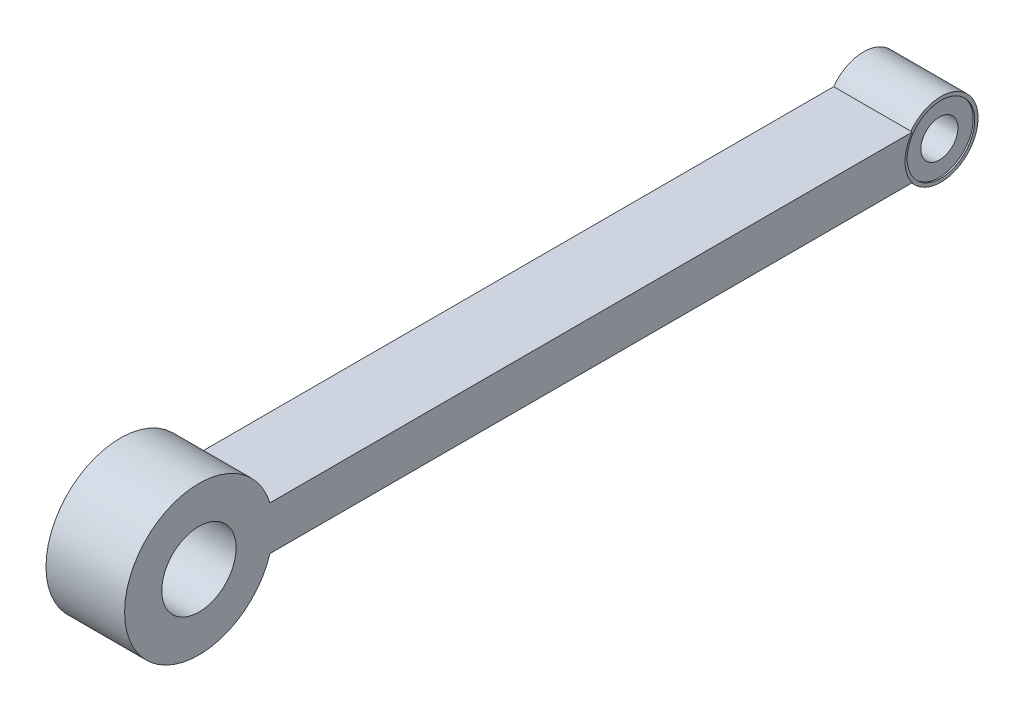
ISO-10303-21;
HEADER;
FILE_DESCRIPTION(('STEP AP214'),'2;1');
FILE_NAME('part.step','',(''),(''),'','','');
FILE_SCHEMA(('AUTOMOTIVE_DESIGN { 1 0 10303 214 1 1 1 1 }'));
ENDSEC;
DATA;
#1=APPLICATION_CONTEXT('core data for automotive mechanical design processes');
#2=APPLICATION_PROTOCOL_DEFINITION('international standard','automotive_design',2000,#1);
#3=PRODUCT_CONTEXT('',#1,'mechanical');
#4=PRODUCT('Part','Part','',(#3));
#5=PRODUCT_RELATED_PRODUCT_CATEGORY('part','',(#4));
#6=PRODUCT_DEFINITION_FORMATION('','',#4);
#7=PRODUCT_DEFINITION_CONTEXT('part definition',#1,'design');
#8=PRODUCT_DEFINITION('design','',#6,#7);
#9=PRODUCT_DEFINITION_SHAPE('','',#8);
#10=(LENGTH_UNIT() NAMED_UNIT(*) SI_UNIT(.MILLI.,.METRE.));
#11=(NAMED_UNIT(*) PLANE_ANGLE_UNIT() SI_UNIT($,.RADIAN.));
#12=(NAMED_UNIT(*) SI_UNIT($,.STERADIAN.) SOLID_ANGLE_UNIT());
#13=UNCERTAINTY_MEASURE_WITH_UNIT(LENGTH_MEASURE(1.E-05),#10,'distance_accuracy_value','');
#14=(GEOMETRIC_REPRESENTATION_CONTEXT(3) GLOBAL_UNCERTAINTY_ASSIGNED_CONTEXT((#13)) GLOBAL_UNIT_ASSIGNED_CONTEXT((#10,
#11,#12)) REPRESENTATION_CONTEXT('',''));
#15=CARTESIAN_POINT('',(0.,0.,0.));
#16=DIRECTION('',(0.,0.,1.));
#17=DIRECTION('',(1.,0.,0.));
#18=AXIS2_PLACEMENT_3D('',#15,#16,#17);
#19=CARTESIAN_POINT('',(5.,0.,0.));
#20=DIRECTION('',(-1.,0.,0.));
#21=DIRECTION('',(0.,0.,1.));
#22=AXIS2_PLACEMENT_3D('',#19,#20,#21);
#23=CYLINDRICAL_SURFACE('',#22,2.5);
#24=CARTESIAN_POINT('',(-0.1,0.,0.));
#25=DIRECTION('',(-1.,0.,0.));
#26=DIRECTION('',(0.,0.,1.));
#27=AXIS2_PLACEMENT_3D('',#24,#25,#26);
#28=CIRCLE('',#27,2.5);
#29=CARTESIAN_POINT('',(-0.1,0.,2.5));
#30=VERTEX_POINT('',#29);
#31=EDGE_CURVE('E138',#30,#30,#28,.T.);
#32=ORIENTED_EDGE('',*,*,#31,.F.);
#33=EDGE_LOOP('',(#32));
#34=FACE_BOUND('',#33,.T.);
#35=DIRECTION('',(-1.,0.,0.));
#36=VECTOR('',#35,1.);
#37=CARTESIAN_POINT('',(5.,1.4776837253196,2.01654427373306));
#38=LINE('',#37,#36);
#39=CARTESIAN_POINT('',(-0.0986851721139197,1.4776837253196,2.01654427373306));
#40=VERTEX_POINT('',#39);
#41=CARTESIAN_POINT('',(5.1,1.4776837253196,2.01654427373306));
#42=VERTEX_POINT('',#41);
#43=EDGE_CURVE('E117',#40,#42,#38,.F.);
#44=ORIENTED_EDGE('',*,*,#43,.T.);
#45=CARTESIAN_POINT('',(5.1,0.,0.));
#46=DIRECTION('',(1.,0.,0.));
#47=DIRECTION('',(0.,0.,-1.));
#48=AXIS2_PLACEMENT_3D('',#45,#46,#47);
#49=CIRCLE('',#48,2.5);
#50=CARTESIAN_POINT('',(5.1,-1.4776837253196,2.01654427373306));
#51=VERTEX_POINT('',#50);
#52=EDGE_CURVE('E127',#51,#42,#49,.T.);
#53=ORIENTED_EDGE('',*,*,#52,.F.);
#54=DIRECTION('',(-1.,0.,0.));
#55=VECTOR('',#54,1.);
#56=CARTESIAN_POINT('',(5.,-1.4776837253196,2.01654427373306));
#57=LINE('',#56,#55);
#58=CARTESIAN_POINT('',(-0.0986851721139197,-1.4776837253196,2.01654427373306));
#59=VERTEX_POINT('',#58);
#60=EDGE_CURVE('E93',#59,#51,#57,.F.);
#61=ORIENTED_EDGE('',*,*,#60,.F.);
#62=CARTESIAN_POINT('',(-0.0986851721139197,0.,0.));
#63=DIRECTION('',(-1.,0.,0.));
#64=DIRECTION('',(0.,0.,1.));
#65=AXIS2_PLACEMENT_3D('',#62,#63,#64);
#66=CIRCLE('',#65,2.5);
#67=EDGE_CURVE('E98',#40,#59,#66,.F.);
#68=ORIENTED_EDGE('',*,*,#67,.F.);
#69=EDGE_LOOP('',(#44,#53,#61,#68));
#70=FACE_BOUND('',#69,.T.);
#71=ADVANCED_FACE('F41',(#34,#70),#23,.T.);
#72=CARTESIAN_POINT('',(5.,0.,0.));
#73=DIRECTION('',(1.,0.,0.));
#74=DIRECTION('',(0.,0.,-1.));
#75=AXIS2_PLACEMENT_3D('',#72,#73,#74);
#76=PLANE('',#75);
#77=CARTESIAN_POINT('',(5.,0.,0.));
#78=DIRECTION('',(1.,0.,0.));
#79=DIRECTION('',(0.,0.,-1.));
#80=AXIS2_PLACEMENT_3D('',#77,#78,#79);
#81=CIRCLE('',#80,1.25);
#82=CARTESIAN_POINT('',(5.,0.,-1.25));
#83=VERTEX_POINT('',#82);
#84=EDGE_CURVE('E149',#83,#83,#81,.T.);
#85=ORIENTED_EDGE('',*,*,#84,.F.);
#86=EDGE_LOOP('',(#85));
#87=FACE_BOUND('',#86,.T.);
#88=CARTESIAN_POINT('',(5.,0.,0.));
#89=DIRECTION('',(1.,0.,0.));
#90=DIRECTION('',(0.,0.,-1.));
#91=AXIS2_PLACEMENT_3D('',#88,#89,#90);
#92=CIRCLE('',#91,2.26959288168946);
#93=CARTESIAN_POINT('',(5.,0.,-2.26959288168946));
#94=VERTEX_POINT('',#93);
#95=EDGE_CURVE('E50',#94,#94,#92,.F.);
#96=ORIENTED_EDGE('',*,*,#95,.F.);
#97=EDGE_LOOP('',(#96));
#98=FACE_BOUND('',#97,.T.);
#99=ADVANCED_FACE('F159',(#87,#98),#76,.T.);
#100=CARTESIAN_POINT('',(0.,0.,0.));
#101=DIRECTION('',(1.,0.,0.));
#102=DIRECTION('',(0.,0.,-1.));
#103=AXIS2_PLACEMENT_3D('',#100,#101,#102);
#104=PLANE('',#103);
#105=CARTESIAN_POINT('',(0.,0.,0.));
#106=DIRECTION('',(-1.,0.,0.));
#107=DIRECTION('',(0.,0.,1.));
#108=AXIS2_PLACEMENT_3D('',#105,#106,#107);
#109=CIRCLE('',#108,1.25);
#110=CARTESIAN_POINT('',(0.,0.,1.25));
#111=VERTEX_POINT('',#110);
#112=EDGE_CURVE('E145',#111,#111,#109,.T.);
#113=ORIENTED_EDGE('',*,*,#112,.F.);
#114=EDGE_LOOP('',(#113));
#115=FACE_BOUND('',#114,.T.);
#116=CARTESIAN_POINT('',(0.,0.,0.));
#117=DIRECTION('',(-1.,0.,0.));
#118=DIRECTION('',(0.,0.,1.));
#119=AXIS2_PLACEMENT_3D('',#116,#117,#118);
#120=CIRCLE('',#119,2.10779869601624);
#121=CARTESIAN_POINT('',(0.,0.,2.10779869601624));
#122=VERTEX_POINT('',#121);
#123=EDGE_CURVE('E133',#122,#122,#120,.T.);
#124=ORIENTED_EDGE('',*,*,#123,.T.);
#125=EDGE_LOOP('',(#124));
#126=FACE_BOUND('',#125,.T.);
#127=ADVANCED_FACE('F161',(#115,#126),#104,.F.);
#128=CARTESIAN_POINT('',(10.,0.,0.));
#129=DIRECTION('',(-1.,0.,0.));
#130=DIRECTION('',(0.,0.,1.));
#131=AXIS2_PLACEMENT_3D('',#128,#129,#130);
#132=CYLINDRICAL_SURFACE('',#131,1.25);
#133=ORIENTED_EDGE('',*,*,#84,.T.);
#134=EDGE_LOOP('',(#133));
#135=FACE_BOUND('',#134,.T.);
#136=ORIENTED_EDGE('',*,*,#112,.T.);
#137=EDGE_LOOP('',(#136));
#138=FACE_BOUND('',#137,.T.);
#139=ADVANCED_FACE('F168',(#135,#138),#132,.F.);
#140=CARTESIAN_POINT('',(-0.1,0.,0.));
#141=DIRECTION('',(-1.,0.,0.));
#142=DIRECTION('',(0.,0.,1.));
#143=AXIS2_PLACEMENT_3D('',#140,#141,#142);
#144=PLANE('',#143);
#145=ORIENTED_EDGE('',*,*,#31,.T.);
#146=EDGE_LOOP('',(#145));
#147=FACE_BOUND('',#146,.T.);
#148=CARTESIAN_POINT('',(-0.1,0.,0.));
#149=DIRECTION('',(-1.,0.,0.));
#150=DIRECTION('',(0.,0.,1.));
#151=AXIS2_PLACEMENT_3D('',#148,#149,#150);
#152=CIRCLE('',#151,2.10779869601624);
#153=CARTESIAN_POINT('',(-0.1,0.,2.10779869601624));
#154=VERTEX_POINT('',#153);
#155=EDGE_CURVE('E134',#154,#154,#152,.T.);
#156=ORIENTED_EDGE('',*,*,#155,.F.);
#157=EDGE_LOOP('',(#156));
#158=FACE_BOUND('',#157,.T.);
#159=ADVANCED_FACE('F175',(#147,#158),#144,.T.);
#160=CARTESIAN_POINT('',(-0.1,0.,0.));
#161=DIRECTION('',(1.,0.,0.));
#162=DIRECTION('',(0.,0.,-1.));
#163=AXIS2_PLACEMENT_3D('',#160,#161,#162);
#164=CYLINDRICAL_SURFACE('',#163,2.10779869601624);
#165=ORIENTED_EDGE('',*,*,#155,.T.);
#166=EDGE_LOOP('',(#165));
#167=FACE_BOUND('',#166,.T.);
#168=ORIENTED_EDGE('',*,*,#123,.F.);
#169=EDGE_LOOP('',(#168));
#170=FACE_BOUND('',#169,.T.);
#171=ADVANCED_FACE('F179',(#167,#170),#164,.F.);
#172=CARTESIAN_POINT('',(5.1,0.,0.));
#173=DIRECTION('',(1.,0.,0.));
#174=DIRECTION('',(0.,0.,-1.));
#175=AXIS2_PLACEMENT_3D('',#172,#173,#174);
#176=PLANE('',#175);
#177=EDGE_CURVE('E129',#42,#51,#49,.T.);
#178=ORIENTED_EDGE('',*,*,#177,.T.);
#179=ORIENTED_EDGE('',*,*,#52,.T.);
#180=EDGE_LOOP('',(#178,#179));
#181=FACE_BOUND('',#180,.T.);
#182=CARTESIAN_POINT('',(5.1,0.,0.));
#183=DIRECTION('',(1.,0.,0.));
#184=DIRECTION('',(0.,0.,-1.));
#185=AXIS2_PLACEMENT_3D('',#182,#183,#184);
#186=CIRCLE('',#185,2.26959288168946);
#187=CARTESIAN_POINT('',(5.1,0.,-2.26959288168946));
#188=VERTEX_POINT('',#187);
#189=EDGE_CURVE('E123',#188,#188,#186,.T.);
#190=ORIENTED_EDGE('',*,*,#189,.F.);
#191=EDGE_LOOP('',(#190));
#192=FACE_BOUND('',#191,.T.);
#193=ADVANCED_FACE('F183',(#181,#192),#176,.T.);
#194=CARTESIAN_POINT('',(5.1,0.,0.));
#195=DIRECTION('',(-1.,0.,0.));
#196=DIRECTION('',(0.,0.,1.));
#197=AXIS2_PLACEMENT_3D('',#194,#195,#196);
#198=CYLINDRICAL_SURFACE('',#197,2.26959288168946);
#199=ORIENTED_EDGE('',*,*,#189,.T.);
#200=EDGE_LOOP('',(#199));
#201=FACE_BOUND('',#200,.T.);
#202=ORIENTED_EDGE('',*,*,#95,.T.);
#203=EDGE_LOOP('',(#202));
#204=FACE_BOUND('',#203,.T.);
#205=ADVANCED_FACE('F157',(#201,#204),#198,.F.);
#206=CARTESIAN_POINT('',(5.,0.,0.));
#207=DIRECTION('',(-1.,0.,0.));
#208=DIRECTION('',(0.,0.,1.));
#209=AXIS2_PLACEMENT_3D('',#206,#207,#208);
#210=CYLINDRICAL_SURFACE('',#209,2.5);
#211=CARTESIAN_POINT('',(5.18785574174528,-1.4776837253196,2.01654427373306));
#212=VERTEX_POINT('',#211);
#213=EDGE_CURVE('E87',#51,#212,#57,.F.);
#214=ORIENTED_EDGE('',*,*,#213,.F.);
#215=ORIENTED_EDGE('',*,*,#177,.F.);
#216=CARTESIAN_POINT('',(5.18785574174528,1.4776837253196,2.01654427373306));
#217=VERTEX_POINT('',#216);
#218=EDGE_CURVE('E112',#42,#217,#38,.F.);
#219=ORIENTED_EDGE('',*,*,#218,.T.);
#220=CARTESIAN_POINT('',(5.18785574174528,0.,0.));
#221=DIRECTION('',(-1.,0.,0.));
#222=DIRECTION('',(0.,0.,1.));
#223=AXIS2_PLACEMENT_3D('',#220,#221,#222);
#224=CIRCLE('',#223,2.5);
#225=EDGE_CURVE('E104',#217,#212,#224,.F.);
#226=ORIENTED_EDGE('',*,*,#225,.T.);
#227=EDGE_LOOP('',(#214,#215,#219,#226));
#228=FACE_BOUND('',#227,.T.);
#229=ADVANCED_FACE('F110',(#228),#210,.F.);
#230=CARTESIAN_POINT('',(5.18785574174528,1.4776837253196,-2.501));
#231=DIRECTION('',(-1.,0.,0.));
#232=DIRECTION('',(0.,0.,1.));
#233=AXIS2_PLACEMENT_3D('',#230,#231,#232);
#234=PLANE('',#233);
#235=CARTESIAN_POINT('',(5.18785574174528,0.,50.));
#236=DIRECTION('',(-1.,0.,0.));
#237=DIRECTION('',(0.,0.,1.));
#238=AXIS2_PLACEMENT_3D('',#235,#236,#237);
#239=CIRCLE('',#238,2.5);
#240=CARTESIAN_POINT('',(5.18785574174528,0.,47.5));
#241=VERTEX_POINT('',#240);
#242=EDGE_CURVE('E219',#241,#241,#239,.T.);
#243=ORIENTED_EDGE('',*,*,#242,.T.);
#244=EDGE_LOOP('',(#243));
#245=FACE_BOUND('',#244,.T.);
#246=DIRECTION('',(0.,0.,1.));
#247=VECTOR('',#246,1.);
#248=CARTESIAN_POINT('',(5.18785574174528,1.4776837253196,-2.501));
#249=LINE('',#248,#247);
#250=CARTESIAN_POINT('',(5.18785574174528,1.4776837253196,45.2233431347934));
#251=VERTEX_POINT('',#250);
#252=EDGE_CURVE('E108',#217,#251,#249,.T.);
#253=ORIENTED_EDGE('',*,*,#252,.T.);
#254=CARTESIAN_POINT('',(5.18785574174528,0.,50.));
#255=DIRECTION('',(1.,0.,0.));
#256=DIRECTION('',(0.,0.,-1.));
#257=AXIS2_PLACEMENT_3D('',#254,#255,#256);
#258=CIRCLE('',#257,5.);
#259=CARTESIAN_POINT('',(5.18785574174528,-1.4776837253196,45.2233431347934));
#260=VERTEX_POINT('',#259);
#261=EDGE_CURVE('E106',#251,#260,#258,.T.);
#262=ORIENTED_EDGE('',*,*,#261,.T.);
#263=DIRECTION('',(0.,0.,1.));
#264=VECTOR('',#263,1.);
#265=CARTESIAN_POINT('',(5.18785574174528,-1.4776837253196,-2.501));
#266=LINE('',#265,#264);
#267=EDGE_CURVE('E90',#212,#260,#266,.T.);
#268=ORIENTED_EDGE('',*,*,#267,.F.);
#269=ORIENTED_EDGE('',*,*,#225,.F.);
#270=EDGE_LOOP('',(#253,#262,#268,#269));
#271=FACE_BOUND('',#270,.T.);
#272=ADVANCED_FACE('F103',(#245,#271),#234,.F.);
#273=CARTESIAN_POINT('',(-0.0986851721139197,1.4776837253196,-2.501));
#274=DIRECTION('',(0.,-1.,0.));
#275=DIRECTION('',(0.,0.,-1.));
#276=AXIS2_PLACEMENT_3D('',#273,#274,#275);
#277=PLANE('',#276);
#278=DIRECTION('',(0.,0.,1.));
#279=VECTOR('',#278,1.);
#280=CARTESIAN_POINT('',(-0.0986851721139197,1.4776837253196,-2.501));
#281=LINE('',#280,#279);
#282=CARTESIAN_POINT('',(-0.0986851721139197,1.4776837253196,45.2233431347934));
#283=VERTEX_POINT('',#282);
#284=EDGE_CURVE('E62',#40,#283,#281,.T.);
#285=ORIENTED_EDGE('',*,*,#284,.T.);
#286=DIRECTION('',(1.,0.,0.));
#287=VECTOR('',#286,1.);
#288=CARTESIAN_POINT('',(-0.0986851721139197,1.4776837253196,45.2233431347934));
#289=LINE('',#288,#287);
#290=EDGE_CURVE('E57',#283,#251,#289,.T.);
#291=ORIENTED_EDGE('',*,*,#290,.T.);
#292=ORIENTED_EDGE('',*,*,#252,.F.);
#293=ORIENTED_EDGE('',*,*,#218,.F.);
#294=ORIENTED_EDGE('',*,*,#43,.F.);
#295=EDGE_LOOP('',(#285,#291,#292,#293,#294));
#296=FACE_BOUND('',#295,.T.);
#297=ADVANCED_FACE('F197',(#296),#277,.F.);
#298=CARTESIAN_POINT('',(-0.0986851721139197,1.4776837253196,-2.501));
#299=DIRECTION('',(-1.,0.,0.));
#300=DIRECTION('',(0.,0.,1.));
#301=AXIS2_PLACEMENT_3D('',#298,#299,#300);
#302=PLANE('',#301);
#303=CARTESIAN_POINT('',(-0.0986851721139197,0.,50.));
#304=DIRECTION('',(-1.,0.,0.));
#305=DIRECTION('',(0.,0.,1.));
#306=AXIS2_PLACEMENT_3D('',#303,#304,#305);
#307=CIRCLE('',#306,2.5);
#308=CARTESIAN_POINT('',(-0.0986851721139197,0.,47.5));
#309=VERTEX_POINT('',#308);
#310=EDGE_CURVE('E44',#309,#309,#307,.T.);
#311=ORIENTED_EDGE('',*,*,#310,.F.);
#312=EDGE_LOOP('',(#311));
#313=FACE_BOUND('',#312,.T.);
#314=DIRECTION('',(0.,0.,1.));
#315=VECTOR('',#314,1.);
#316=CARTESIAN_POINT('',(-0.0986851721139197,-1.4776837253196,-2.501));
#317=LINE('',#316,#315);
#318=CARTESIAN_POINT('',(-0.0986851721139197,-1.4776837253196,45.2233431347934));
#319=VERTEX_POINT('',#318);
#320=EDGE_CURVE('E128',#59,#319,#317,.T.);
#321=ORIENTED_EDGE('',*,*,#320,.T.);
#322=CARTESIAN_POINT('',(-0.0986851721139197,0.,50.));
#323=DIRECTION('',(1.,0.,0.));
#324=DIRECTION('',(0.,0.,-1.));
#325=AXIS2_PLACEMENT_3D('',#322,#323,#324);
#326=CIRCLE('',#325,5.);
#327=EDGE_CURVE('E119',#283,#319,#326,.T.);
#328=ORIENTED_EDGE('',*,*,#327,.F.);
#329=ORIENTED_EDGE('',*,*,#284,.F.);
#330=ORIENTED_EDGE('',*,*,#67,.T.);
#331=EDGE_LOOP('',(#321,#328,#329,#330));
#332=FACE_BOUND('',#331,.T.);
#333=ADVANCED_FACE('F194',(#313,#332),#302,.T.);
#334=CARTESIAN_POINT('',(-0.0986851721139197,-1.4776837253196,-2.501));
#335=DIRECTION('',(0.,-1.,0.));
#336=DIRECTION('',(0.,0.,-1.));
#337=AXIS2_PLACEMENT_3D('',#334,#335,#336);
#338=PLANE('',#337);
#339=DIRECTION('',(1.,0.,0.));
#340=VECTOR('',#339,1.);
#341=CARTESIAN_POINT('',(-0.0986851721139197,-1.4776837253196,45.2233431347934));
#342=LINE('',#341,#340);
#343=EDGE_CURVE('E11',#319,#260,#342,.T.);
#344=ORIENTED_EDGE('',*,*,#343,.F.);
#345=ORIENTED_EDGE('',*,*,#320,.F.);
#346=ORIENTED_EDGE('',*,*,#60,.T.);
#347=ORIENTED_EDGE('',*,*,#213,.T.);
#348=ORIENTED_EDGE('',*,*,#267,.T.);
#349=EDGE_LOOP('',(#344,#345,#346,#347,#348));
#350=FACE_BOUND('',#349,.T.);
#351=ADVANCED_FACE('F89',(#350),#338,.T.);
#352=CARTESIAN_POINT('',(-0.0986851721139197,0.,50.));
#353=DIRECTION('',(1.,0.,0.));
#354=DIRECTION('',(0.,0.,-1.));
#355=AXIS2_PLACEMENT_3D('',#352,#353,#354);
#356=CYLINDRICAL_SURFACE('',#355,5.);
#357=ORIENTED_EDGE('',*,*,#290,.F.);
#358=ORIENTED_EDGE('',*,*,#327,.T.);
#359=ORIENTED_EDGE('',*,*,#343,.T.);
#360=ORIENTED_EDGE('',*,*,#261,.F.);
#361=EDGE_LOOP('',(#357,#358,#359,#360));
#362=FACE_BOUND('',#361,.T.);
#363=ADVANCED_FACE('F193',(#362),#356,.T.);
#364=CARTESIAN_POINT('',(-0.1,0.,50.));
#365=DIRECTION('',(1.,0.,0.));
#366=DIRECTION('',(0.,0.,-1.));
#367=AXIS2_PLACEMENT_3D('',#364,#365,#366);
#368=CYLINDRICAL_SURFACE('',#367,2.5);
#369=CARTESIAN_POINT('',(-0.0986851721139197,0.,47.5));
#370=CARTESIAN_POINT('',(-0.043617037594553,0.,47.5));
#371=CARTESIAN_POINT('',(0.0114510969248136,0.,47.5));
#372=CARTESIAN_POINT('',(0.121587365963547,0.,47.5));
#373=CARTESIAN_POINT('',(0.176655500482914,0.,47.5));
#374=CARTESIAN_POINT('',(0.286791769521647,0.,47.5));
#375=CARTESIAN_POINT('',(0.341859904041014,0.,47.5));
#376=CARTESIAN_POINT('',(0.451996173079747,0.,47.5));
#377=CARTESIAN_POINT('',(0.507064307599113,0.,47.5));
#378=CARTESIAN_POINT('',(0.617200576637847,0.,47.5));
#379=CARTESIAN_POINT('',(0.672268711157213,0.,47.5));
#380=CARTESIAN_POINT('',(0.782404980195947,0.,47.5));
#381=CARTESIAN_POINT('',(0.837473114715313,0.,47.5));
#382=CARTESIAN_POINT('',(0.947609383754047,0.,47.5));
#383=CARTESIAN_POINT('',(1.00267751827341,0.,47.5));
#384=CARTESIAN_POINT('',(1.11281378731215,0.,47.5));
#385=CARTESIAN_POINT('',(1.16788192183151,0.,47.5));
#386=CARTESIAN_POINT('',(1.27801819087025,0.,47.5));
#387=CARTESIAN_POINT('',(1.33308632538961,0.,47.5));
#388=CARTESIAN_POINT('',(1.44322259442835,0.,47.5));
#389=CARTESIAN_POINT('',(1.49829072894771,0.,47.5));
#390=CARTESIAN_POINT('',(1.60842699798645,0.,47.5));
#391=CARTESIAN_POINT('',(1.66349513250581,0.,47.5));
#392=CARTESIAN_POINT('',(1.77363140154455,0.,47.5));
#393=CARTESIAN_POINT('',(1.82869953606391,0.,47.5));
#394=CARTESIAN_POINT('',(1.93883580510265,0.,47.5));
#395=CARTESIAN_POINT('',(1.99390393962201,0.,47.5));
#396=CARTESIAN_POINT('',(2.10404020866075,0.,47.5));
#397=CARTESIAN_POINT('',(2.15910834318011,0.,47.5));
#398=CARTESIAN_POINT('',(2.26924461221885,0.,47.5));
#399=CARTESIAN_POINT('',(2.32431274673821,0.,47.5));
#400=CARTESIAN_POINT('',(2.43444901577695,0.,47.5));
#401=CARTESIAN_POINT('',(2.48951715029631,0.,47.5));
#402=CARTESIAN_POINT('',(2.59965341933505,0.,47.5));
#403=CARTESIAN_POINT('',(2.65472155385441,0.,47.5));
#404=CARTESIAN_POINT('',(2.76485782289315,0.,47.5));
#405=CARTESIAN_POINT('',(2.81992595741251,0.,47.5));
#406=CARTESIAN_POINT('',(2.93006222645125,0.,47.5));
#407=CARTESIAN_POINT('',(2.98513036097061,0.,47.5));
#408=CARTESIAN_POINT('',(3.09526663000935,0.,47.5));
#409=CARTESIAN_POINT('',(3.15033476452871,0.,47.5));
#410=CARTESIAN_POINT('',(3.26047103356745,0.,47.5));
#411=CARTESIAN_POINT('',(3.31553916808681,0.,47.5));
#412=CARTESIAN_POINT('',(3.42567543712555,0.,47.5));
#413=CARTESIAN_POINT('',(3.48074357164491,0.,47.5));
#414=CARTESIAN_POINT('',(3.59087984068365,0.,47.5));
#415=CARTESIAN_POINT('',(3.64594797520301,0.,47.5));
#416=CARTESIAN_POINT('',(3.75608424424175,0.,47.5));
#417=CARTESIAN_POINT('',(3.81115237876111,0.,47.5));
#418=CARTESIAN_POINT('',(3.92128864779985,0.,47.5));
#419=CARTESIAN_POINT('',(3.97635678231921,0.,47.5));
#420=CARTESIAN_POINT('',(4.08649305135795,0.,47.5));
#421=CARTESIAN_POINT('',(4.14156118587731,0.,47.5));
#422=CARTESIAN_POINT('',(4.25169745491605,0.,47.5));
#423=CARTESIAN_POINT('',(4.30676558943541,0.,47.5));
#424=CARTESIAN_POINT('',(4.41690185847415,0.,47.5));
#425=CARTESIAN_POINT('',(4.47196999299351,0.,47.5));
#426=CARTESIAN_POINT('',(4.58210626203225,0.,47.5));
#427=CARTESIAN_POINT('',(4.63717439655161,0.,47.5));
#428=CARTESIAN_POINT('',(4.74731066559035,0.,47.5));
#429=CARTESIAN_POINT('',(4.80237880010971,0.,47.5));
#430=CARTESIAN_POINT('',(4.91251506914845,0.,47.5));
#431=CARTESIAN_POINT('',(4.96758320366781,0.,47.5));
#432=CARTESIAN_POINT('',(5.07771947270655,0.,47.5));
#433=CARTESIAN_POINT('',(5.13278760722591,0.,47.5));
#434=CARTESIAN_POINT('',(5.18785574174528,0.,47.5));
#435=B_SPLINE_CURVE_WITH_KNOTS('',3,(#369,#370,#371,#372,#373,#374,#375,#376,#377,#378,#379,
#380,#381,#382,#383,#384,#385,#386,#387,#388,#389,#390,#391,#392,#393,#394,#395,#396,#397,#398,
#399,#400,#401,#402,#403,#404,#405,#406,#407,#408,#409,#410,#411,#412,#413,#414,#415,#416,#417,
#418,#419,#420,#421,#422,#423,#424,#425,#426,#427,#428,#429,#430,#431,#432,#433,#434),
.UNSPECIFIED.,.F.,.F.,(4,2,2,2,2,2,2,2,2,2,2,2,2,2,2,2,2,2,2,2,2,2,2,2,2,2,2,2,2,2,2,2,4),(0.,
0.1652044035581,0.3304088071162,0.4956132106743,0.6608176142324,0.8260220177905,0.9912264213486,
1.1564308249067,1.3216352284648,1.4868396320229,1.652044035581,1.8172484391391,1.9824528426972,
2.1476572462553,2.3128616498134,2.4780660533715,2.6432704569296,2.8084748604877,2.9736792640458,
3.1388836676039,3.304088071162,3.4692924747201,3.6344968782782,3.7997012818363,3.9649056853944,
4.1301100889525,4.2953144925106,4.4605188960687,4.6257232996268,4.7909277031849,4.956132106743,
5.1213365103011,5.2865409138592),.UNSPECIFIED.);
#436=EDGE_CURVE('BSEAM208',#309,#241,#435,.T.);
#437=ORIENTED_EDGE('',*,*,#310,.T.);
#438=ORIENTED_EDGE('',*,*,#242,.F.);
#439=ORIENTED_EDGE('',*,*,#436,.T.);
#440=ORIENTED_EDGE('',*,*,#436,.F.);
#441=EDGE_LOOP('',(#437,#439,#438,#440));
#442=FACE_BOUND('',#441,.T.);
#443=ADVANCED_FACE('F208',(#442),#368,.F.);
#444=CLOSED_SHELL('',(#71,#99,#127,#139,#159,#171,#193,#205,#229,#272,#297,#333,#351,#363,#443));
#445=MANIFOLD_SOLID_BREP('B2',#444);
#446=ADVANCED_BREP_SHAPE_REPRESENTATION('',(#18,#445),#14);
#447=SHAPE_DEFINITION_REPRESENTATION(#9,#446);
ENDSEC;
END-ISO-10303-21;
